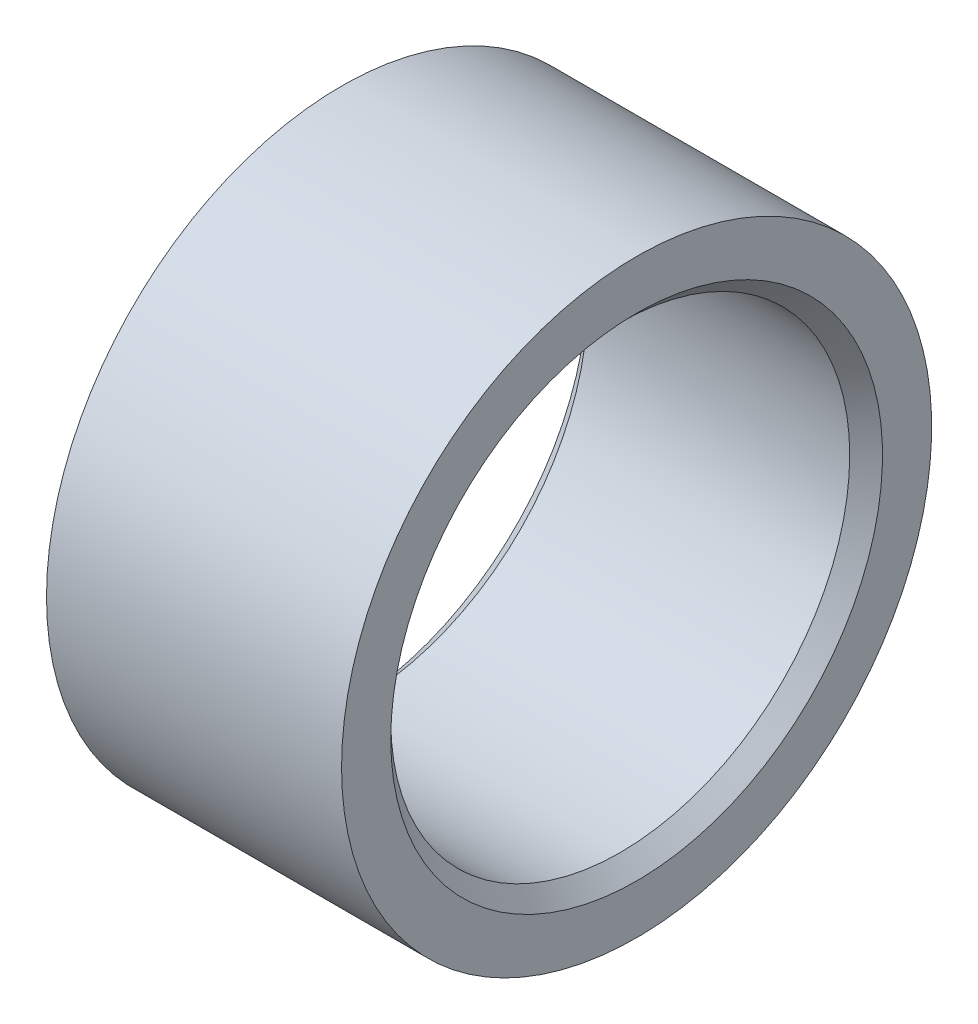
ISO-10303-21;
HEADER;
FILE_DESCRIPTION(('STEP AP214'),'2;1');
FILE_NAME('part.step','',(''),(''),'','','');
FILE_SCHEMA(('AUTOMOTIVE_DESIGN { 1 0 10303 214 1 1 1 1 }'));
ENDSEC;
DATA;
#1=APPLICATION_CONTEXT('core data for automotive mechanical design processes');
#2=APPLICATION_PROTOCOL_DEFINITION('international standard','automotive_design',2000,#1);
#3=PRODUCT_CONTEXT('',#1,'mechanical');
#4=PRODUCT('Part','Part','',(#3));
#5=PRODUCT_RELATED_PRODUCT_CATEGORY('part','',(#4));
#6=PRODUCT_DEFINITION_FORMATION('','',#4);
#7=PRODUCT_DEFINITION_CONTEXT('part definition',#1,'design');
#8=PRODUCT_DEFINITION('design','',#6,#7);
#9=PRODUCT_DEFINITION_SHAPE('','',#8);
#10=(LENGTH_UNIT() NAMED_UNIT(*) SI_UNIT(.MILLI.,.METRE.));
#11=(NAMED_UNIT(*) PLANE_ANGLE_UNIT() SI_UNIT($,.RADIAN.));
#12=(NAMED_UNIT(*) SI_UNIT($,.STERADIAN.) SOLID_ANGLE_UNIT());
#13=UNCERTAINTY_MEASURE_WITH_UNIT(LENGTH_MEASURE(1.E-05),#10,'distance_accuracy_value','');
#14=(GEOMETRIC_REPRESENTATION_CONTEXT(3) GLOBAL_UNCERTAINTY_ASSIGNED_CONTEXT((#13)) GLOBAL_UNIT_ASSIGNED_CONTEXT((#10,
#11,#12)) REPRESENTATION_CONTEXT('',''));
#15=CARTESIAN_POINT('',(0.,0.,0.));
#16=DIRECTION('',(0.,0.,1.));
#17=DIRECTION('',(1.,0.,0.));
#18=AXIS2_PLACEMENT_3D('',#15,#16,#17);
#19=CARTESIAN_POINT('',(-9.,9.,0.));
#20=DIRECTION('',(1.,0.,0.));
#21=DIRECTION('',(0.,0.,-1.));
#22=AXIS2_PLACEMENT_3D('',#19,#20,#21);
#23=PLANE('',#22);
#24=CARTESIAN_POINT('',(-9.,0.,0.));
#25=DIRECTION('',(1.,0.,0.));
#26=DIRECTION('',(0.,0.,-1.));
#27=AXIS2_PLACEMENT_3D('',#24,#25,#26);
#28=CIRCLE('',#27,7.5);
#29=CARTESIAN_POINT('',(-9.,0.,-7.5));
#30=VERTEX_POINT('',#29);
#31=EDGE_CURVE('E354',#30,#30,#28,.T.);
#32=ORIENTED_EDGE('',*,*,#31,.T.);
#33=EDGE_LOOP('',(#32));
#34=FACE_BOUND('',#33,.T.);
#35=CARTESIAN_POINT('',(-9.,0.,0.));
#36=DIRECTION('',(-1.,0.,0.));
#37=DIRECTION('',(0.,0.,1.));
#38=AXIS2_PLACEMENT_3D('',#35,#36,#37);
#39=CIRCLE('',#38,9.);
#40=CARTESIAN_POINT('',(-9.,0.,9.));
#41=VERTEX_POINT('',#40);
#42=EDGE_CURVE('E370',#41,#41,#39,.T.);
#43=ORIENTED_EDGE('',*,*,#42,.T.);
#44=EDGE_LOOP('',(#43));
#45=FACE_BOUND('',#44,.T.);
#46=ADVANCED_FACE('F348',(#34,#45),#23,.F.);
#47=CARTESIAN_POINT('',(-22.8121909836195,0.,0.));
#48=DIRECTION('',(-1.,0.,0.));
#49=DIRECTION('',(0.,0.,1.));
#50=AXIS2_PLACEMENT_3D('',#47,#48,#49);
#51=CYLINDRICAL_SURFACE('',#50,7.);
#52=CARTESIAN_POINT('',(-8.5,0.,0.));
#53=DIRECTION('',(1.,0.,0.));
#54=DIRECTION('',(0.,0.,-1.));
#55=AXIS2_PLACEMENT_3D('',#52,#53,#54);
#56=CIRCLE('',#55,7.);
#57=CARTESIAN_POINT('',(-8.5,0.,-7.));
#58=VERTEX_POINT('',#57);
#59=EDGE_CURVE('E358',#58,#58,#56,.F.);
#60=ORIENTED_EDGE('',*,*,#59,.T.);
#61=EDGE_LOOP('',(#60));
#62=FACE_BOUND('',#61,.T.);
#63=CARTESIAN_POINT('',(-0.5,0.,0.));
#64=DIRECTION('',(-1.,0.,0.));
#65=DIRECTION('',(0.,0.,1.));
#66=AXIS2_PLACEMENT_3D('',#63,#64,#65);
#67=CIRCLE('',#66,7.);
#68=CARTESIAN_POINT('',(-0.5,0.,7.));
#69=VERTEX_POINT('',#68);
#70=EDGE_CURVE('E362',#69,#69,#67,.F.);
#71=ORIENTED_EDGE('',*,*,#70,.T.);
#72=EDGE_LOOP('',(#71));
#73=FACE_BOUND('',#72,.T.);
#74=ADVANCED_FACE('F384',(#62,#73),#51,.F.);
#75=CARTESIAN_POINT('',(0.,9.,0.));
#76=DIRECTION('',(-1.,0.,0.));
#77=DIRECTION('',(0.,0.,1.));
#78=AXIS2_PLACEMENT_3D('',#75,#76,#77);
#79=PLANE('',#78);
#80=CARTESIAN_POINT('',(0.,0.,0.));
#81=DIRECTION('',(-1.,0.,0.));
#82=DIRECTION('',(0.,0.,1.));
#83=AXIS2_PLACEMENT_3D('',#80,#81,#82);
#84=CIRCLE('',#83,7.5);
#85=CARTESIAN_POINT('',(0.,0.,7.5));
#86=VERTEX_POINT('',#85);
#87=EDGE_CURVE('E10',#86,#86,#84,.T.);
#88=ORIENTED_EDGE('',*,*,#87,.T.);
#89=EDGE_LOOP('',(#88));
#90=FACE_BOUND('',#89,.T.);
#91=CARTESIAN_POINT('',(0.,0.,0.));
#92=DIRECTION('',(-1.,0.,0.));
#93=DIRECTION('',(0.,0.,1.));
#94=AXIS2_PLACEMENT_3D('',#91,#92,#93);
#95=CIRCLE('',#94,9.);
#96=CARTESIAN_POINT('',(0.,0.,9.));
#97=VERTEX_POINT('',#96);
#98=EDGE_CURVE('E367',#97,#97,#95,.T.);
#99=ORIENTED_EDGE('',*,*,#98,.F.);
#100=EDGE_LOOP('',(#99));
#101=FACE_BOUND('',#100,.T.);
#102=ADVANCED_FACE('F379',(#90,#101),#79,.F.);
#103=CARTESIAN_POINT('',(-22.8121909836195,0.,0.));
#104=DIRECTION('',(-1.,0.,0.));
#105=DIRECTION('',(0.,0.,1.));
#106=AXIS2_PLACEMENT_3D('',#103,#104,#105);
#107=CYLINDRICAL_SURFACE('',#106,9.);
#108=ORIENTED_EDGE('',*,*,#42,.F.);
#109=EDGE_LOOP('',(#108));
#110=FACE_BOUND('',#109,.T.);
#111=ORIENTED_EDGE('',*,*,#98,.T.);
#112=EDGE_LOOP('',(#111));
#113=FACE_BOUND('',#112,.T.);
#114=ADVANCED_FACE('F375',(#110,#113),#107,.T.);
#115=CARTESIAN_POINT('',(-8.5,0.,0.));
#116=DIRECTION('',(-1.,0.,0.));
#117=DIRECTION('',(0.,0.,1.));
#118=AXIS2_PLACEMENT_3D('',#115,#116,#117);
#119=CONICAL_SURFACE('',#118,7.,0.78539816339745);
#120=ORIENTED_EDGE('',*,*,#31,.F.);
#121=EDGE_LOOP('',(#120));
#122=FACE_BOUND('',#121,.T.);
#123=ORIENTED_EDGE('',*,*,#59,.F.);
#124=EDGE_LOOP('',(#123));
#125=FACE_BOUND('',#124,.T.);
#126=ADVANCED_FACE('F378',(#122,#125),#119,.F.);
#127=CARTESIAN_POINT('',(0.,0.,0.));
#128=DIRECTION('',(1.,0.,0.));
#129=DIRECTION('',(0.,0.,-1.));
#130=AXIS2_PLACEMENT_3D('',#127,#128,#129);
#131=CONICAL_SURFACE('',#130,7.5,0.785398163397448);
#132=ORIENTED_EDGE('',*,*,#70,.F.);
#133=EDGE_LOOP('',(#132));
#134=FACE_BOUND('',#133,.T.);
#135=ORIENTED_EDGE('',*,*,#87,.F.);
#136=EDGE_LOOP('',(#135));
#137=FACE_BOUND('',#136,.T.);
#138=ADVANCED_FACE('F410',(#134,#137),#131,.F.);
#139=CLOSED_SHELL('',(#46,#74,#102,#114,#126,#138));
#140=MANIFOLD_SOLID_BREP('B2',#139);
#141=ADVANCED_BREP_SHAPE_REPRESENTATION('',(#18,#140),#14);
#142=SHAPE_DEFINITION_REPRESENTATION(#9,#141);
ENDSEC;
END-ISO-10303-21;
